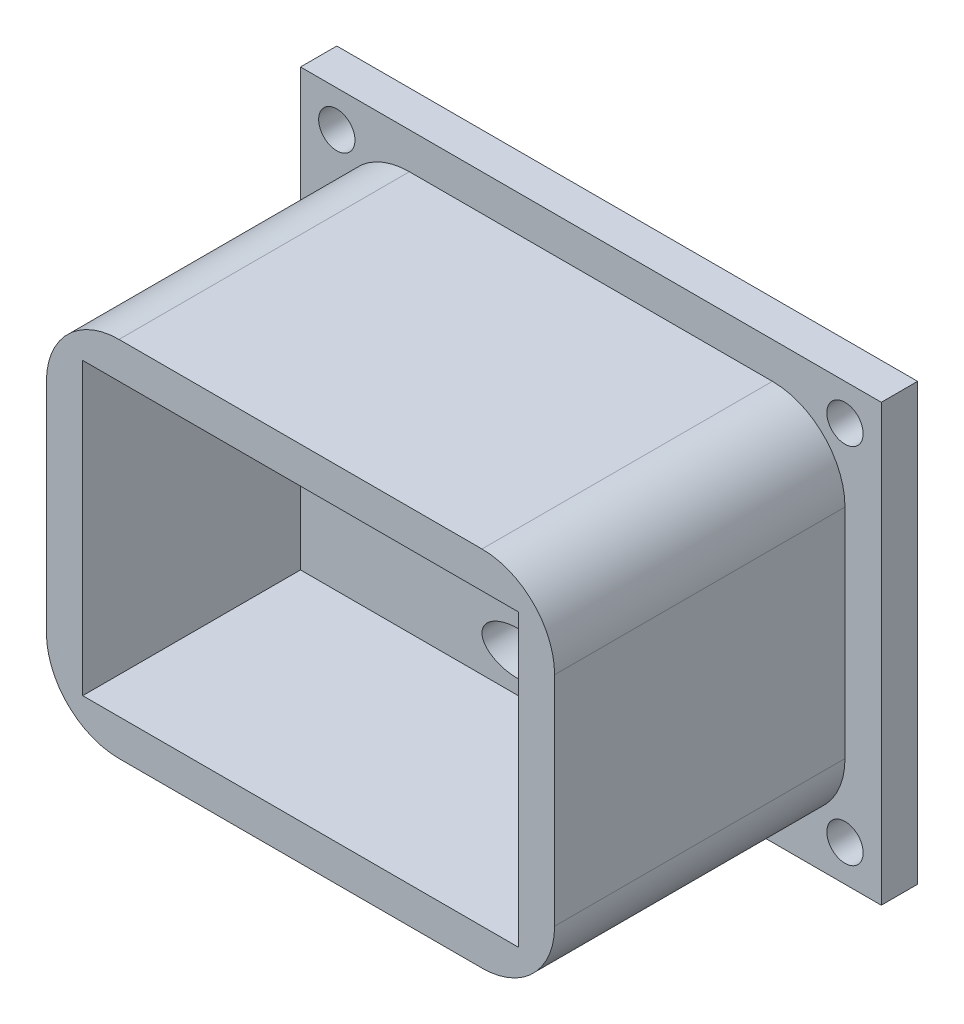
ISO-10303-21;
HEADER;
FILE_DESCRIPTION(('STEP AP214'),'2;1');
FILE_NAME('part.step','',(''),(''),'','','');
FILE_SCHEMA(('AUTOMOTIVE_DESIGN { 1 0 10303 214 1 1 1 1 }'));
ENDSEC;
DATA;
#1=APPLICATION_CONTEXT('core data for automotive mechanical design processes');
#2=APPLICATION_PROTOCOL_DEFINITION('international standard','automotive_design',2000,#1);
#3=PRODUCT_CONTEXT('',#1,'mechanical');
#4=PRODUCT('Part','Part','',(#3));
#5=PRODUCT_RELATED_PRODUCT_CATEGORY('part','',(#4));
#6=PRODUCT_DEFINITION_FORMATION('','',#4);
#7=PRODUCT_DEFINITION_CONTEXT('part definition',#1,'design');
#8=PRODUCT_DEFINITION('design','',#6,#7);
#9=PRODUCT_DEFINITION_SHAPE('','',#8);
#10=(LENGTH_UNIT() NAMED_UNIT(*) SI_UNIT(.MILLI.,.METRE.));
#11=(NAMED_UNIT(*) PLANE_ANGLE_UNIT() SI_UNIT($,.RADIAN.));
#12=(NAMED_UNIT(*) SI_UNIT($,.STERADIAN.) SOLID_ANGLE_UNIT());
#13=UNCERTAINTY_MEASURE_WITH_UNIT(LENGTH_MEASURE(1.E-05),#10,'distance_accuracy_value','');
#14=(GEOMETRIC_REPRESENTATION_CONTEXT(3) GLOBAL_UNCERTAINTY_ASSIGNED_CONTEXT((#13)) GLOBAL_UNIT_ASSIGNED_CONTEXT((#10,
#11,#12)) REPRESENTATION_CONTEXT('',''));
#15=CARTESIAN_POINT('',(0.,0.,0.));
#16=DIRECTION('',(0.,0.,1.));
#17=DIRECTION('',(1.,0.,0.));
#18=AXIS2_PLACEMENT_3D('',#15,#16,#17);
#19=CARTESIAN_POINT('',(0.,0.,40.));
#20=DIRECTION('',(1.,0.,0.));
#21=DIRECTION('',(0.,0.,-1.));
#22=AXIS2_PLACEMENT_3D('',#19,#20,#21);
#23=PLANE('',#22);
#24=DIRECTION('',(0.,-1.,0.));
#25=VECTOR('',#24,1.);
#26=CARTESIAN_POINT('',(0.,0.,0.));
#27=LINE('',#26,#25);
#28=CARTESIAN_POINT('',(0.,40.,0.));
#29=VERTEX_POINT('',#28);
#30=CARTESIAN_POINT('',(0.,10.,0.));
#31=VERTEX_POINT('',#30);
#32=EDGE_CURVE('E201',#29,#31,#27,.T.);
#33=ORIENTED_EDGE('',*,*,#32,.T.);
#34=DIRECTION('',(0.,0.,-1.));
#35=VECTOR('',#34,1.);
#36=CARTESIAN_POINT('',(0.,10.,40.));
#37=LINE('',#36,#35);
#38=CARTESIAN_POINT('',(0.,10.,40.));
#39=VERTEX_POINT('',#38);
#40=EDGE_CURVE('E251',#31,#39,#37,.F.);
#41=ORIENTED_EDGE('',*,*,#40,.T.);
#42=DIRECTION('',(0.,-1.,0.));
#43=VECTOR('',#42,1.);
#44=CARTESIAN_POINT('',(0.,0.,40.));
#45=LINE('',#44,#43);
#46=CARTESIAN_POINT('',(0.,40.,40.));
#47=VERTEX_POINT('',#46);
#48=EDGE_CURVE('E208',#47,#39,#45,.T.);
#49=ORIENTED_EDGE('',*,*,#48,.F.);
#50=DIRECTION('',(0.,0.,-1.));
#51=VECTOR('',#50,1.);
#52=CARTESIAN_POINT('',(0.,40.,40.));
#53=LINE('',#52,#51);
#54=EDGE_CURVE('E248',#47,#29,#53,.T.);
#55=ORIENTED_EDGE('',*,*,#54,.T.);
#56=EDGE_LOOP('',(#33,#41,#49,#55));
#57=FACE_BOUND('',#56,.T.);
#58=ADVANCED_FACE('F33',(#57),#23,.F.);
#59=CARTESIAN_POINT('',(0.,0.,40.));
#60=DIRECTION('',(0.,1.,0.));
#61=DIRECTION('',(0.,0.,1.));
#62=AXIS2_PLACEMENT_3D('',#59,#60,#61);
#63=PLANE('',#62);
#64=DIRECTION('',(1.,0.,0.));
#65=VECTOR('',#64,1.);
#66=CARTESIAN_POINT('',(0.,0.,0.));
#67=LINE('',#66,#65);
#68=CARTESIAN_POINT('',(10.,0.,0.));
#69=VERTEX_POINT('',#68);
#70=CARTESIAN_POINT('',(60.,0.,0.));
#71=VERTEX_POINT('',#70);
#72=EDGE_CURVE('E224',#69,#71,#67,.T.);
#73=ORIENTED_EDGE('',*,*,#72,.T.);
#74=DIRECTION('',(0.,0.,-1.));
#75=VECTOR('',#74,1.);
#76=CARTESIAN_POINT('',(60.,0.,40.));
#77=LINE('',#76,#75);
#78=CARTESIAN_POINT('',(60.,0.,40.));
#79=VERTEX_POINT('',#78);
#80=EDGE_CURVE('E238',#71,#79,#77,.F.);
#81=ORIENTED_EDGE('',*,*,#80,.T.);
#82=DIRECTION('',(1.,0.,0.));
#83=VECTOR('',#82,1.);
#84=CARTESIAN_POINT('',(0.,0.,40.));
#85=LINE('',#84,#83);
#86=CARTESIAN_POINT('',(10.,0.,40.));
#87=VERTEX_POINT('',#86);
#88=EDGE_CURVE('E211',#87,#79,#85,.T.);
#89=ORIENTED_EDGE('',*,*,#88,.F.);
#90=DIRECTION('',(0.,0.,-1.));
#91=VECTOR('',#90,1.);
#92=CARTESIAN_POINT('',(10.,0.,40.));
#93=LINE('',#92,#91);
#94=EDGE_CURVE('E235',#87,#69,#93,.T.);
#95=ORIENTED_EDGE('',*,*,#94,.T.);
#96=EDGE_LOOP('',(#73,#81,#89,#95));
#97=FACE_BOUND('',#96,.T.);
#98=ADVANCED_FACE('F288',(#97),#63,.F.);
#99=CARTESIAN_POINT('',(70.,0.,40.));
#100=DIRECTION('',(-1.,0.,0.));
#101=DIRECTION('',(0.,0.,1.));
#102=AXIS2_PLACEMENT_3D('',#99,#100,#101);
#103=PLANE('',#102);
#104=DIRECTION('',(0.,1.,0.));
#105=VECTOR('',#104,1.);
#106=CARTESIAN_POINT('',(70.,0.,40.));
#107=LINE('',#106,#105);
#108=CARTESIAN_POINT('',(70.,10.,40.));
#109=VERTEX_POINT('',#108);
#110=CARTESIAN_POINT('',(70.,40.,40.));
#111=VERTEX_POINT('',#110);
#112=EDGE_CURVE('E215',#109,#111,#107,.T.);
#113=ORIENTED_EDGE('',*,*,#112,.F.);
#114=DIRECTION('',(0.,0.,-1.));
#115=VECTOR('',#114,1.);
#116=CARTESIAN_POINT('',(70.,10.,40.));
#117=LINE('',#116,#115);
#118=CARTESIAN_POINT('',(70.,10.,0.));
#119=VERTEX_POINT('',#118);
#120=EDGE_CURVE('E232',#109,#119,#117,.T.);
#121=ORIENTED_EDGE('',*,*,#120,.T.);
#122=DIRECTION('',(0.,1.,0.));
#123=VECTOR('',#122,1.);
#124=CARTESIAN_POINT('',(70.,0.,0.));
#125=LINE('',#124,#123);
#126=CARTESIAN_POINT('',(70.,40.,0.));
#127=VERTEX_POINT('',#126);
#128=EDGE_CURVE('E227',#119,#127,#125,.T.);
#129=ORIENTED_EDGE('',*,*,#128,.T.);
#130=DIRECTION('',(0.,0.,-1.));
#131=VECTOR('',#130,1.);
#132=CARTESIAN_POINT('',(70.,40.,40.));
#133=LINE('',#132,#131);
#134=EDGE_CURVE('E221',#127,#111,#133,.F.);
#135=ORIENTED_EDGE('',*,*,#134,.T.);
#136=EDGE_LOOP('',(#113,#121,#129,#135));
#137=FACE_BOUND('',#136,.T.);
#138=ADVANCED_FACE('F265',(#137),#103,.F.);
#139=CARTESIAN_POINT('',(0.,50.,40.));
#140=DIRECTION('',(0.,-1.,0.));
#141=DIRECTION('',(0.,0.,-1.));
#142=AXIS2_PLACEMENT_3D('',#139,#140,#141);
#143=PLANE('',#142);
#144=DIRECTION('',(-1.,0.,0.));
#145=VECTOR('',#144,1.);
#146=CARTESIAN_POINT('',(0.,50.,40.));
#147=LINE('',#146,#145);
#148=CARTESIAN_POINT('',(60.,50.,40.));
#149=VERTEX_POINT('',#148);
#150=CARTESIAN_POINT('',(10.,50.,40.));
#151=VERTEX_POINT('',#150);
#152=EDGE_CURVE('E218',#149,#151,#147,.T.);
#153=ORIENTED_EDGE('',*,*,#152,.F.);
#154=DIRECTION('',(0.,0.,-1.));
#155=VECTOR('',#154,1.);
#156=CARTESIAN_POINT('',(60.,50.,40.));
#157=LINE('',#156,#155);
#158=CARTESIAN_POINT('',(60.,50.,0.));
#159=VERTEX_POINT('',#158);
#160=EDGE_CURVE('E255',#149,#159,#157,.T.);
#161=ORIENTED_EDGE('',*,*,#160,.T.);
#162=DIRECTION('',(-1.,0.,0.));
#163=VECTOR('',#162,1.);
#164=CARTESIAN_POINT('',(0.,50.,0.));
#165=LINE('',#164,#163);
#166=CARTESIAN_POINT('',(10.,50.,0.));
#167=VERTEX_POINT('',#166);
#168=EDGE_CURVE('E212',#159,#167,#165,.T.);
#169=ORIENTED_EDGE('',*,*,#168,.T.);
#170=DIRECTION('',(0.,0.,-1.));
#171=VECTOR('',#170,1.);
#172=CARTESIAN_POINT('',(10.,50.,40.));
#173=LINE('',#172,#171);
#174=EDGE_CURVE('E253',#167,#151,#173,.F.);
#175=ORIENTED_EDGE('',*,*,#174,.T.);
#176=EDGE_LOOP('',(#153,#161,#169,#175));
#177=FACE_BOUND('',#176,.T.);
#178=ADVANCED_FACE('F274',(#177),#143,.F.);
#179=CARTESIAN_POINT('',(0.,0.,40.));
#180=DIRECTION('',(0.,0.,-1.));
#181=DIRECTION('',(-1.,0.,0.));
#182=AXIS2_PLACEMENT_3D('',#179,#180,#181);
#183=PLANE('',#182);
#184=DIRECTION('',(1.,0.,0.));
#185=VECTOR('',#184,1.);
#186=CARTESIAN_POINT('',(65.,5.00000000000001,40.));
#187=LINE('',#186,#185);
#188=CARTESIAN_POINT('',(5.,5.00000000000001,40.));
#189=VERTEX_POINT('',#188);
#190=CARTESIAN_POINT('',(65.,5.00000000000001,40.));
#191=VERTEX_POINT('',#190);
#192=EDGE_CURVE('E172',#189,#191,#187,.T.);
#193=ORIENTED_EDGE('',*,*,#192,.F.);
#194=DIRECTION('',(0.,-1.,0.));
#195=VECTOR('',#194,1.);
#196=CARTESIAN_POINT('',(5.,5.00000000000001,40.));
#197=LINE('',#196,#195);
#198=CARTESIAN_POINT('',(5.,45.,40.));
#199=VERTEX_POINT('',#198);
#200=EDGE_CURVE('E170',#199,#189,#197,.T.);
#201=ORIENTED_EDGE('',*,*,#200,.F.);
#202=DIRECTION('',(-1.,0.,0.));
#203=VECTOR('',#202,1.);
#204=CARTESIAN_POINT('',(5.,45.,40.));
#205=LINE('',#204,#203);
#206=CARTESIAN_POINT('',(65.,45.,40.));
#207=VERTEX_POINT('',#206);
#208=EDGE_CURVE('E182',#207,#199,#205,.T.);
#209=ORIENTED_EDGE('',*,*,#208,.F.);
#210=DIRECTION('',(0.,1.,0.));
#211=VECTOR('',#210,1.);
#212=CARTESIAN_POINT('',(65.,45.,40.));
#213=LINE('',#212,#211);
#214=EDGE_CURVE('E194',#191,#207,#213,.T.);
#215=ORIENTED_EDGE('',*,*,#214,.F.);
#216=EDGE_LOOP('',(#193,#201,#209,#215));
#217=FACE_BOUND('',#216,.T.);
#218=ORIENTED_EDGE('',*,*,#88,.T.);
#219=CARTESIAN_POINT('',(60.,10.,40.));
#220=DIRECTION('',(0.,0.,-1.));
#221=DIRECTION('',(-1.,0.,0.));
#222=AXIS2_PLACEMENT_3D('',#219,#220,#221);
#223=CIRCLE('',#222,10.);
#224=EDGE_CURVE('E246',#79,#109,#223,.F.);
#225=ORIENTED_EDGE('',*,*,#224,.T.);
#226=ORIENTED_EDGE('',*,*,#112,.T.);
#227=CARTESIAN_POINT('',(60.,40.,40.));
#228=DIRECTION('',(0.,0.,-1.));
#229=DIRECTION('',(-1.,0.,0.));
#230=AXIS2_PLACEMENT_3D('',#227,#228,#229);
#231=CIRCLE('',#230,10.);
#232=EDGE_CURVE('E242',#111,#149,#231,.F.);
#233=ORIENTED_EDGE('',*,*,#232,.T.);
#234=ORIENTED_EDGE('',*,*,#152,.T.);
#235=CARTESIAN_POINT('',(10.,40.,40.));
#236=DIRECTION('',(0.,0.,-1.));
#237=DIRECTION('',(-1.,0.,0.));
#238=AXIS2_PLACEMENT_3D('',#235,#236,#237);
#239=CIRCLE('',#238,10.);
#240=EDGE_CURVE('E240',#151,#47,#239,.F.);
#241=ORIENTED_EDGE('',*,*,#240,.T.);
#242=ORIENTED_EDGE('',*,*,#48,.T.);
#243=CARTESIAN_POINT('',(10.,10.,40.));
#244=DIRECTION('',(0.,0.,-1.));
#245=DIRECTION('',(-1.,0.,0.));
#246=AXIS2_PLACEMENT_3D('',#243,#244,#245);
#247=CIRCLE('',#246,10.);
#248=EDGE_CURVE('E244',#39,#87,#247,.F.);
#249=ORIENTED_EDGE('',*,*,#248,.T.);
#250=EDGE_LOOP('',(#218,#225,#226,#233,#234,#241,#242,#249));
#251=FACE_BOUND('',#250,.T.);
#252=ADVANCED_FACE('F271',(#217,#251),#183,.F.);
#253=CARTESIAN_POINT('',(5.,5.00000000000001,10.));
#254=DIRECTION('',(-1.,0.,0.));
#255=DIRECTION('',(0.,0.,1.));
#256=AXIS2_PLACEMENT_3D('',#253,#254,#255);
#257=PLANE('',#256);
#258=ORIENTED_EDGE('',*,*,#200,.T.);
#259=DIRECTION('',(0.,0.,1.));
#260=VECTOR('',#259,1.);
#261=CARTESIAN_POINT('',(5.,5.00000000000001,10.));
#262=LINE('',#261,#260);
#263=CARTESIAN_POINT('',(5.,5.00000000000001,10.));
#264=VERTEX_POINT('',#263);
#265=EDGE_CURVE('E190',#264,#189,#262,.T.);
#266=ORIENTED_EDGE('',*,*,#265,.F.);
#267=DIRECTION('',(0.,-1.,0.));
#268=VECTOR('',#267,1.);
#269=CARTESIAN_POINT('',(5.,5.00000000000001,10.));
#270=LINE('',#269,#268);
#271=CARTESIAN_POINT('',(5.,45.,10.));
#272=VERTEX_POINT('',#271);
#273=EDGE_CURVE('E178',#272,#264,#270,.T.);
#274=ORIENTED_EDGE('',*,*,#273,.F.);
#275=DIRECTION('',(0.,0.,1.));
#276=VECTOR('',#275,1.);
#277=CARTESIAN_POINT('',(5.,45.,10.));
#278=LINE('',#277,#276);
#279=EDGE_CURVE('E199',#272,#199,#278,.T.);
#280=ORIENTED_EDGE('',*,*,#279,.T.);
#281=EDGE_LOOP('',(#258,#266,#274,#280));
#282=FACE_BOUND('',#281,.T.);
#283=ADVANCED_FACE('F316',(#282),#257,.F.);
#284=CARTESIAN_POINT('',(5.,45.,10.));
#285=DIRECTION('',(0.,1.,0.));
#286=DIRECTION('',(0.,0.,1.));
#287=AXIS2_PLACEMENT_3D('',#284,#285,#286);
#288=PLANE('',#287);
#289=ORIENTED_EDGE('',*,*,#208,.T.);
#290=ORIENTED_EDGE('',*,*,#279,.F.);
#291=DIRECTION('',(-1.,0.,0.));
#292=VECTOR('',#291,1.);
#293=CARTESIAN_POINT('',(5.,45.,10.));
#294=LINE('',#293,#292);
#295=CARTESIAN_POINT('',(65.,45.,10.));
#296=VERTEX_POINT('',#295);
#297=EDGE_CURVE('E188',#296,#272,#294,.T.);
#298=ORIENTED_EDGE('',*,*,#297,.F.);
#299=DIRECTION('',(0.,0.,1.));
#300=VECTOR('',#299,1.);
#301=CARTESIAN_POINT('',(65.,45.,10.));
#302=LINE('',#301,#300);
#303=EDGE_CURVE('E202',#296,#207,#302,.T.);
#304=ORIENTED_EDGE('',*,*,#303,.T.);
#305=EDGE_LOOP('',(#289,#290,#298,#304));
#306=FACE_BOUND('',#305,.T.);
#307=ADVANCED_FACE('F320',(#306),#288,.F.);
#308=CARTESIAN_POINT('',(65.,45.,10.));
#309=DIRECTION('',(1.,0.,0.));
#310=DIRECTION('',(0.,0.,-1.));
#311=AXIS2_PLACEMENT_3D('',#308,#309,#310);
#312=PLANE('',#311);
#313=ORIENTED_EDGE('',*,*,#214,.T.);
#314=ORIENTED_EDGE('',*,*,#303,.F.);
#315=DIRECTION('',(0.,1.,0.));
#316=VECTOR('',#315,1.);
#317=CARTESIAN_POINT('',(65.,45.,10.));
#318=LINE('',#317,#316);
#319=CARTESIAN_POINT('',(65.,5.00000000000001,10.));
#320=VERTEX_POINT('',#319);
#321=EDGE_CURVE('E185',#320,#296,#318,.T.);
#322=ORIENTED_EDGE('',*,*,#321,.F.);
#323=DIRECTION('',(0.,0.,1.));
#324=VECTOR('',#323,1.);
#325=CARTESIAN_POINT('',(65.,5.00000000000001,10.));
#326=LINE('',#325,#324);
#327=EDGE_CURVE('E204',#320,#191,#326,.T.);
#328=ORIENTED_EDGE('',*,*,#327,.T.);
#329=EDGE_LOOP('',(#313,#314,#322,#328));
#330=FACE_BOUND('',#329,.T.);
#331=ADVANCED_FACE('F326',(#330),#312,.F.);
#332=CARTESIAN_POINT('',(65.,5.00000000000001,10.));
#333=DIRECTION('',(0.,-1.,0.));
#334=DIRECTION('',(0.,0.,-1.));
#335=AXIS2_PLACEMENT_3D('',#332,#333,#334);
#336=PLANE('',#335);
#337=ORIENTED_EDGE('',*,*,#192,.T.);
#338=ORIENTED_EDGE('',*,*,#327,.F.);
#339=DIRECTION('',(1.,0.,0.));
#340=VECTOR('',#339,1.);
#341=CARTESIAN_POINT('',(65.,5.00000000000001,10.));
#342=LINE('',#341,#340);
#343=EDGE_CURVE('E181',#264,#320,#342,.T.);
#344=ORIENTED_EDGE('',*,*,#343,.F.);
#345=ORIENTED_EDGE('',*,*,#265,.T.);
#346=EDGE_LOOP('',(#337,#338,#344,#345));
#347=FACE_BOUND('',#346,.T.);
#348=ADVANCED_FACE('F322',(#347),#336,.F.);
#349=CARTESIAN_POINT('',(0.,0.,10.));
#350=DIRECTION('',(0.,0.,-1.));
#351=DIRECTION('',(-1.,0.,0.));
#352=AXIS2_PLACEMENT_3D('',#349,#350,#351);
#353=PLANE('',#352);
#354=CARTESIAN_POINT('',(35.,10.,10.));
#355=DIRECTION('',(0.,0.,1.));
#356=DIRECTION('',(-1.,0.,0.));
#357=AXIS2_PLACEMENT_3D('',#354,#355,#356);
#358=ELLIPSE('',#357,5.,3.);
#359=CARTESIAN_POINT('',(30.,10.,10.));
#360=VERTEX_POINT('',#359);
#361=EDGE_CURVE('E374',#360,#360,#358,.T.);
#362=ORIENTED_EDGE('',*,*,#361,.F.);
#363=EDGE_LOOP('',(#362));
#364=FACE_BOUND('',#363,.T.);
#365=ORIENTED_EDGE('',*,*,#273,.T.);
#366=ORIENTED_EDGE('',*,*,#343,.T.);
#367=ORIENTED_EDGE('',*,*,#321,.T.);
#368=ORIENTED_EDGE('',*,*,#297,.T.);
#369=EDGE_LOOP('',(#365,#366,#367,#368));
#370=FACE_BOUND('',#369,.T.);
#371=ADVANCED_FACE('F325',(#364,#370),#353,.F.);
#372=CARTESIAN_POINT('',(0.,0.,0.));
#373=DIRECTION('',(0.,0.,1.));
#374=DIRECTION('',(1.,0.,0.));
#375=AXIS2_PLACEMENT_3D('',#372,#373,#374);
#376=PLANE('',#375);
#377=CARTESIAN_POINT('',(0.,0.,0.));
#378=DIRECTION('',(0.,0.,1.));
#379=DIRECTION('',(1.,0.,0.));
#380=AXIS2_PLACEMENT_3D('',#377,#378,#379);
#381=CIRCLE('',#380,2.5);
#382=CARTESIAN_POINT('',(2.5,0.,0.));
#383=VERTEX_POINT('',#382);
#384=EDGE_CURVE('E393',#383,#383,#381,.T.);
#385=ORIENTED_EDGE('',*,*,#384,.F.);
#386=EDGE_LOOP('',(#385));
#387=FACE_BOUND('',#386,.T.);
#388=CARTESIAN_POINT('',(70.,0.,0.));
#389=DIRECTION('',(0.,0.,1.));
#390=DIRECTION('',(1.,0.,0.));
#391=AXIS2_PLACEMENT_3D('',#388,#389,#390);
#392=CIRCLE('',#391,2.5);
#393=CARTESIAN_POINT('',(72.5,0.,0.));
#394=VERTEX_POINT('',#393);
#395=EDGE_CURVE('E387',#394,#394,#392,.T.);
#396=ORIENTED_EDGE('',*,*,#395,.F.);
#397=EDGE_LOOP('',(#396));
#398=FACE_BOUND('',#397,.T.);
#399=CARTESIAN_POINT('',(70.,50.,0.));
#400=DIRECTION('',(0.,0.,1.));
#401=DIRECTION('',(1.,0.,0.));
#402=AXIS2_PLACEMENT_3D('',#399,#400,#401);
#403=CIRCLE('',#402,2.50000000000001);
#404=CARTESIAN_POINT('',(72.5,50.,0.));
#405=VERTEX_POINT('',#404);
#406=EDGE_CURVE('E381',#405,#405,#403,.T.);
#407=ORIENTED_EDGE('',*,*,#406,.F.);
#408=EDGE_LOOP('',(#407));
#409=FACE_BOUND('',#408,.T.);
#410=CARTESIAN_POINT('',(0.,50.,0.));
#411=DIRECTION('',(0.,0.,1.));
#412=DIRECTION('',(1.,0.,0.));
#413=AXIS2_PLACEMENT_3D('',#410,#411,#412);
#414=CIRCLE('',#413,2.5);
#415=CARTESIAN_POINT('',(2.5,50.,0.));
#416=VERTEX_POINT('',#415);
#417=EDGE_CURVE('E380',#416,#416,#414,.T.);
#418=ORIENTED_EDGE('',*,*,#417,.F.);
#419=EDGE_LOOP('',(#418));
#420=FACE_BOUND('',#419,.T.);
#421=DIRECTION('',(-1.,0.,0.));
#422=VECTOR('',#421,1.);
#423=CARTESIAN_POINT('',(-4.99999999999999,-5.,0.));
#424=LINE('',#423,#422);
#425=CARTESIAN_POINT('',(75.,-5.,0.));
#426=VERTEX_POINT('',#425);
#427=CARTESIAN_POINT('',(-4.99999999999999,-5.,0.));
#428=VERTEX_POINT('',#427);
#429=EDGE_CURVE('E399',#426,#428,#424,.T.);
#430=ORIENTED_EDGE('',*,*,#429,.F.);
#431=DIRECTION('',(0.,-1.,0.));
#432=VECTOR('',#431,1.);
#433=CARTESIAN_POINT('',(75.,50.,0.));
#434=LINE('',#433,#432);
#435=CARTESIAN_POINT('',(75.,55.,0.));
#436=VERTEX_POINT('',#435);
#437=EDGE_CURVE('E165',#436,#426,#434,.T.);
#438=ORIENTED_EDGE('',*,*,#437,.F.);
#439=DIRECTION('',(1.,0.,0.));
#440=VECTOR('',#439,1.);
#441=CARTESIAN_POINT('',(75.,55.,0.));
#442=LINE('',#441,#440);
#443=CARTESIAN_POINT('',(-4.99999999999999,55.,0.));
#444=VERTEX_POINT('',#443);
#445=EDGE_CURVE('E408',#444,#436,#442,.T.);
#446=ORIENTED_EDGE('',*,*,#445,.F.);
#447=DIRECTION('',(0.,1.,0.));
#448=VECTOR('',#447,1.);
#449=CARTESIAN_POINT('',(-4.99999999999999,55.,0.));
#450=LINE('',#449,#448);
#451=EDGE_CURVE('E406',#428,#444,#450,.T.);
#452=ORIENTED_EDGE('',*,*,#451,.F.);
#453=EDGE_LOOP('',(#430,#438,#446,#452));
#454=FACE_BOUND('',#453,.T.);
#455=ORIENTED_EDGE('',*,*,#32,.F.);
#456=CARTESIAN_POINT('',(10.,40.,0.));
#457=DIRECTION('',(0.,0.,1.));
#458=DIRECTION('',(1.,0.,0.));
#459=AXIS2_PLACEMENT_3D('',#456,#457,#458);
#460=CIRCLE('',#459,10.);
#461=EDGE_CURVE('E11',#29,#167,#460,.F.);
#462=ORIENTED_EDGE('',*,*,#461,.T.);
#463=ORIENTED_EDGE('',*,*,#168,.F.);
#464=CARTESIAN_POINT('',(60.,40.,0.));
#465=DIRECTION('',(0.,0.,1.));
#466=DIRECTION('',(1.,0.,0.));
#467=AXIS2_PLACEMENT_3D('',#464,#465,#466);
#468=CIRCLE('',#467,10.);
#469=EDGE_CURVE('E42',#159,#127,#468,.F.);
#470=ORIENTED_EDGE('',*,*,#469,.T.);
#471=ORIENTED_EDGE('',*,*,#128,.F.);
#472=CARTESIAN_POINT('',(60.,10.,0.));
#473=DIRECTION('',(0.,0.,1.));
#474=DIRECTION('',(1.,0.,0.));
#475=AXIS2_PLACEMENT_3D('',#472,#473,#474);
#476=CIRCLE('',#475,10.);
#477=EDGE_CURVE('E257',#119,#71,#476,.F.);
#478=ORIENTED_EDGE('',*,*,#477,.T.);
#479=ORIENTED_EDGE('',*,*,#72,.F.);
#480=CARTESIAN_POINT('',(10.,10.,0.));
#481=DIRECTION('',(0.,0.,1.));
#482=DIRECTION('',(1.,0.,0.));
#483=AXIS2_PLACEMENT_3D('',#480,#481,#482);
#484=CIRCLE('',#483,10.);
#485=EDGE_CURVE('E259',#69,#31,#484,.F.);
#486=ORIENTED_EDGE('',*,*,#485,.T.);
#487=EDGE_LOOP('',(#455,#462,#463,#470,#471,#478,#479,#486));
#488=FACE_BOUND('',#487,.T.);
#489=ADVANCED_FACE('F262',(#387,#398,#409,#420,#454,#488),#376,.T.);
#490=CARTESIAN_POINT('',(-4.99999999999999,-5.,-5.));
#491=DIRECTION('',(0.,1.,0.));
#492=DIRECTION('',(0.,0.,1.));
#493=AXIS2_PLACEMENT_3D('',#490,#491,#492);
#494=PLANE('',#493);
#495=ORIENTED_EDGE('',*,*,#429,.T.);
#496=DIRECTION('',(0.,0.,1.));
#497=VECTOR('',#496,1.);
#498=CARTESIAN_POINT('',(-4.99999999999999,-5.,-5.));
#499=LINE('',#498,#497);
#500=CARTESIAN_POINT('',(-4.99999999999999,-5.,-5.));
#501=VERTEX_POINT('',#500);
#502=EDGE_CURVE('E152',#501,#428,#499,.T.);
#503=ORIENTED_EDGE('',*,*,#502,.F.);
#504=DIRECTION('',(-1.,0.,0.));
#505=VECTOR('',#504,1.);
#506=CARTESIAN_POINT('',(-4.99999999999999,-5.,-5.));
#507=LINE('',#506,#505);
#508=CARTESIAN_POINT('',(75.,-5.,-5.));
#509=VERTEX_POINT('',#508);
#510=EDGE_CURVE('E146',#509,#501,#507,.T.);
#511=ORIENTED_EDGE('',*,*,#510,.F.);
#512=DIRECTION('',(0.,0.,1.));
#513=VECTOR('',#512,1.);
#514=CARTESIAN_POINT('',(75.,-5.,-5.));
#515=LINE('',#514,#513);
#516=EDGE_CURVE('E150',#509,#426,#515,.T.);
#517=ORIENTED_EDGE('',*,*,#516,.T.);
#518=EDGE_LOOP('',(#495,#503,#511,#517));
#519=FACE_BOUND('',#518,.T.);
#520=ADVANCED_FACE('F148',(#519),#494,.F.);
#521=CARTESIAN_POINT('',(-4.99999999999999,55.,-5.));
#522=DIRECTION('',(1.,0.,0.));
#523=DIRECTION('',(0.,0.,-1.));
#524=AXIS2_PLACEMENT_3D('',#521,#522,#523);
#525=PLANE('',#524);
#526=ORIENTED_EDGE('',*,*,#451,.T.);
#527=DIRECTION('',(0.,0.,1.));
#528=VECTOR('',#527,1.);
#529=CARTESIAN_POINT('',(-4.99999999999999,55.,-5.));
#530=LINE('',#529,#528);
#531=CARTESIAN_POINT('',(-4.99999999999999,55.,-5.));
#532=VERTEX_POINT('',#531);
#533=EDGE_CURVE('E174',#532,#444,#530,.T.);
#534=ORIENTED_EDGE('',*,*,#533,.F.);
#535=DIRECTION('',(0.,1.,0.));
#536=VECTOR('',#535,1.);
#537=CARTESIAN_POINT('',(-4.99999999999999,55.,-5.));
#538=LINE('',#537,#536);
#539=EDGE_CURVE('E155',#501,#532,#538,.T.);
#540=ORIENTED_EDGE('',*,*,#539,.F.);
#541=ORIENTED_EDGE('',*,*,#502,.T.);
#542=EDGE_LOOP('',(#526,#534,#540,#541));
#543=FACE_BOUND('',#542,.T.);
#544=ADVANCED_FACE('F339',(#543),#525,.F.);
#545=CARTESIAN_POINT('',(75.,55.,-5.));
#546=DIRECTION('',(0.,-1.,0.));
#547=DIRECTION('',(0.,0.,-1.));
#548=AXIS2_PLACEMENT_3D('',#545,#546,#547);
#549=PLANE('',#548);
#550=ORIENTED_EDGE('',*,*,#445,.T.);
#551=DIRECTION('',(0.,0.,1.));
#552=VECTOR('',#551,1.);
#553=CARTESIAN_POINT('',(75.,55.,-5.));
#554=LINE('',#553,#552);
#555=CARTESIAN_POINT('',(75.,55.,-5.));
#556=VERTEX_POINT('',#555);
#557=EDGE_CURVE('E404',#556,#436,#554,.T.);
#558=ORIENTED_EDGE('',*,*,#557,.F.);
#559=DIRECTION('',(1.,0.,0.));
#560=VECTOR('',#559,1.);
#561=CARTESIAN_POINT('',(75.,55.,-5.));
#562=LINE('',#561,#560);
#563=EDGE_CURVE('E161',#532,#556,#562,.T.);
#564=ORIENTED_EDGE('',*,*,#563,.F.);
#565=ORIENTED_EDGE('',*,*,#533,.T.);
#566=EDGE_LOOP('',(#550,#558,#564,#565));
#567=FACE_BOUND('',#566,.T.);
#568=ADVANCED_FACE('F342',(#567),#549,.F.);
#569=CARTESIAN_POINT('',(75.,50.,-5.));
#570=DIRECTION('',(-1.,0.,0.));
#571=DIRECTION('',(0.,0.,1.));
#572=AXIS2_PLACEMENT_3D('',#569,#570,#571);
#573=PLANE('',#572);
#574=ORIENTED_EDGE('',*,*,#437,.T.);
#575=ORIENTED_EDGE('',*,*,#516,.F.);
#576=DIRECTION('',(0.,-1.,0.));
#577=VECTOR('',#576,1.);
#578=CARTESIAN_POINT('',(75.,-5.,-5.));
#579=LINE('',#578,#577);
#580=EDGE_CURVE('E156',#556,#509,#579,.T.);
#581=ORIENTED_EDGE('',*,*,#580,.F.);
#582=ORIENTED_EDGE('',*,*,#557,.T.);
#583=EDGE_LOOP('',(#574,#575,#581,#582));
#584=FACE_BOUND('',#583,.T.);
#585=ADVANCED_FACE('F167',(#584),#573,.F.);
#586=CARTESIAN_POINT('',(0.,0.,-5.));
#587=DIRECTION('',(0.,0.,1.));
#588=DIRECTION('',(1.,0.,0.));
#589=AXIS2_PLACEMENT_3D('',#586,#587,#588);
#590=PLANE('',#589);
#591=CARTESIAN_POINT('',(35.,10.,-5.));
#592=DIRECTION('',(0.,0.,1.));
#593=DIRECTION('',(-1.,0.,0.));
#594=AXIS2_PLACEMENT_3D('',#591,#592,#593);
#595=ELLIPSE('',#594,5.,3.);
#596=CARTESIAN_POINT('',(30.,10.,-5.));
#597=VERTEX_POINT('',#596);
#598=EDGE_CURVE('E37',#597,#597,#595,.T.);
#599=ORIENTED_EDGE('',*,*,#598,.T.);
#600=EDGE_LOOP('',(#599));
#601=FACE_BOUND('',#600,.T.);
#602=CARTESIAN_POINT('',(0.,0.,-5.));
#603=DIRECTION('',(0.,0.,1.));
#604=DIRECTION('',(1.,0.,0.));
#605=AXIS2_PLACEMENT_3D('',#602,#603,#604);
#606=CIRCLE('',#605,2.5);
#607=CARTESIAN_POINT('',(2.5,0.,-5.));
#608=VERTEX_POINT('',#607);
#609=EDGE_CURVE('E390',#608,#608,#606,.T.);
#610=ORIENTED_EDGE('',*,*,#609,.T.);
#611=EDGE_LOOP('',(#610));
#612=FACE_BOUND('',#611,.T.);
#613=CARTESIAN_POINT('',(70.,0.,-5.));
#614=DIRECTION('',(0.,0.,1.));
#615=DIRECTION('',(1.,0.,0.));
#616=AXIS2_PLACEMENT_3D('',#613,#614,#615);
#617=CIRCLE('',#616,2.5);
#618=CARTESIAN_POINT('',(72.5,0.,-5.));
#619=VERTEX_POINT('',#618);
#620=EDGE_CURVE('E384',#619,#619,#617,.T.);
#621=ORIENTED_EDGE('',*,*,#620,.T.);
#622=EDGE_LOOP('',(#621));
#623=FACE_BOUND('',#622,.T.);
#624=CARTESIAN_POINT('',(70.,50.,-5.));
#625=DIRECTION('',(0.,0.,1.));
#626=DIRECTION('',(1.,0.,0.));
#627=AXIS2_PLACEMENT_3D('',#624,#625,#626);
#628=CIRCLE('',#627,2.50000000000001);
#629=CARTESIAN_POINT('',(72.5,50.,-5.));
#630=VERTEX_POINT('',#629);
#631=EDGE_CURVE('E377',#630,#630,#628,.T.);
#632=ORIENTED_EDGE('',*,*,#631,.T.);
#633=EDGE_LOOP('',(#632));
#634=FACE_BOUND('',#633,.T.);
#635=CARTESIAN_POINT('',(0.,50.,-5.));
#636=DIRECTION('',(0.,0.,1.));
#637=DIRECTION('',(1.,0.,0.));
#638=AXIS2_PLACEMENT_3D('',#635,#636,#637);
#639=CIRCLE('',#638,2.5);
#640=CARTESIAN_POINT('',(2.5,50.,-5.));
#641=VERTEX_POINT('',#640);
#642=EDGE_CURVE('E396',#641,#641,#639,.T.);
#643=ORIENTED_EDGE('',*,*,#642,.T.);
#644=EDGE_LOOP('',(#643));
#645=FACE_BOUND('',#644,.T.);
#646=ORIENTED_EDGE('',*,*,#580,.T.);
#647=ORIENTED_EDGE('',*,*,#510,.T.);
#648=ORIENTED_EDGE('',*,*,#539,.T.);
#649=ORIENTED_EDGE('',*,*,#563,.T.);
#650=EDGE_LOOP('',(#646,#647,#648,#649));
#651=FACE_BOUND('',#650,.T.);
#652=ADVANCED_FACE('F159',(#601,#612,#623,#634,#645,#651),#590,.F.);
#653=CARTESIAN_POINT('',(60.,10.,40.));
#654=DIRECTION('',(0.,0.,-1.));
#655=DIRECTION('',(-1.,0.,0.));
#656=AXIS2_PLACEMENT_3D('',#653,#654,#655);
#657=CYLINDRICAL_SURFACE('',#656,10.);
#658=ORIENTED_EDGE('',*,*,#224,.F.);
#659=ORIENTED_EDGE('',*,*,#80,.F.);
#660=ORIENTED_EDGE('',*,*,#477,.F.);
#661=ORIENTED_EDGE('',*,*,#120,.F.);
#662=EDGE_LOOP('',(#658,#659,#660,#661));
#663=FACE_BOUND('',#662,.T.);
#664=ADVANCED_FACE('F292',(#663),#657,.T.);
#665=CARTESIAN_POINT('',(10.,10.,40.));
#666=DIRECTION('',(0.,0.,-1.));
#667=DIRECTION('',(-1.,0.,0.));
#668=AXIS2_PLACEMENT_3D('',#665,#666,#667);
#669=CYLINDRICAL_SURFACE('',#668,10.);
#670=ORIENTED_EDGE('',*,*,#248,.F.);
#671=ORIENTED_EDGE('',*,*,#40,.F.);
#672=ORIENTED_EDGE('',*,*,#485,.F.);
#673=ORIENTED_EDGE('',*,*,#94,.F.);
#674=EDGE_LOOP('',(#670,#671,#672,#673));
#675=FACE_BOUND('',#674,.T.);
#676=ADVANCED_FACE('F283',(#675),#669,.T.);
#677=CARTESIAN_POINT('',(60.,40.,40.));
#678=DIRECTION('',(0.,0.,-1.));
#679=DIRECTION('',(-1.,0.,0.));
#680=AXIS2_PLACEMENT_3D('',#677,#678,#679);
#681=CYLINDRICAL_SURFACE('',#680,10.);
#682=ORIENTED_EDGE('',*,*,#232,.F.);
#683=ORIENTED_EDGE('',*,*,#134,.F.);
#684=ORIENTED_EDGE('',*,*,#469,.F.);
#685=ORIENTED_EDGE('',*,*,#160,.F.);
#686=EDGE_LOOP('',(#682,#683,#684,#685));
#687=FACE_BOUND('',#686,.T.);
#688=ADVANCED_FACE('F268',(#687),#681,.T.);
#689=CARTESIAN_POINT('',(10.,40.,40.));
#690=DIRECTION('',(0.,0.,-1.));
#691=DIRECTION('',(-1.,0.,0.));
#692=AXIS2_PLACEMENT_3D('',#689,#690,#691);
#693=CYLINDRICAL_SURFACE('',#692,10.);
#694=ORIENTED_EDGE('',*,*,#240,.F.);
#695=ORIENTED_EDGE('',*,*,#174,.F.);
#696=ORIENTED_EDGE('',*,*,#461,.F.);
#697=ORIENTED_EDGE('',*,*,#54,.F.);
#698=EDGE_LOOP('',(#694,#695,#696,#697));
#699=FACE_BOUND('',#698,.T.);
#700=ADVANCED_FACE('F35',(#699),#693,.T.);
#701=CARTESIAN_POINT('',(0.,50.,-5.));
#702=DIRECTION('',(0.,0.,1.));
#703=DIRECTION('',(1.,0.,0.));
#704=AXIS2_PLACEMENT_3D('',#701,#702,#703);
#705=CYLINDRICAL_SURFACE('',#704,2.5);
#706=ORIENTED_EDGE('',*,*,#642,.F.);
#707=EDGE_LOOP('',(#706));
#708=FACE_BOUND('',#707,.T.);
#709=ORIENTED_EDGE('',*,*,#417,.T.);
#710=EDGE_LOOP('',(#709));
#711=FACE_BOUND('',#710,.T.);
#712=ADVANCED_FACE('F352',(#708,#711),#705,.F.);
#713=CARTESIAN_POINT('',(70.,50.,-5.));
#714=DIRECTION('',(0.,0.,1.));
#715=DIRECTION('',(1.,0.,0.));
#716=AXIS2_PLACEMENT_3D('',#713,#714,#715);
#717=CYLINDRICAL_SURFACE('',#716,2.50000000000001);
#718=ORIENTED_EDGE('',*,*,#631,.F.);
#719=EDGE_LOOP('',(#718));
#720=FACE_BOUND('',#719,.T.);
#721=ORIENTED_EDGE('',*,*,#406,.T.);
#722=EDGE_LOOP('',(#721));
#723=FACE_BOUND('',#722,.T.);
#724=ADVANCED_FACE('F355',(#720,#723),#717,.F.);
#725=CARTESIAN_POINT('',(70.,0.,-5.));
#726=DIRECTION('',(0.,0.,1.));
#727=DIRECTION('',(1.,0.,0.));
#728=AXIS2_PLACEMENT_3D('',#725,#726,#727);
#729=CYLINDRICAL_SURFACE('',#728,2.5);
#730=ORIENTED_EDGE('',*,*,#620,.F.);
#731=EDGE_LOOP('',(#730));
#732=FACE_BOUND('',#731,.T.);
#733=ORIENTED_EDGE('',*,*,#395,.T.);
#734=EDGE_LOOP('',(#733));
#735=FACE_BOUND('',#734,.T.);
#736=ADVANCED_FACE('F361',(#732,#735),#729,.F.);
#737=CARTESIAN_POINT('',(0.,0.,-5.));
#738=DIRECTION('',(0.,0.,1.));
#739=DIRECTION('',(1.,0.,0.));
#740=AXIS2_PLACEMENT_3D('',#737,#738,#739);
#741=CYLINDRICAL_SURFACE('',#740,2.5);
#742=ORIENTED_EDGE('',*,*,#609,.F.);
#743=EDGE_LOOP('',(#742));
#744=FACE_BOUND('',#743,.T.);
#745=ORIENTED_EDGE('',*,*,#384,.T.);
#746=EDGE_LOOP('',(#745));
#747=FACE_BOUND('',#746,.T.);
#748=ADVANCED_FACE('F357',(#744,#747),#741,.F.);
#749=CARTESIAN_POINT('',(35.,10.,-10.));
#750=DIRECTION('',(0.,0.,1.));
#751=DIRECTION('',(-1.,0.,0.));
#752=AXIS2_PLACEMENT_3D('',#749,#750,#751);
#753=ELLIPSE('',#752,5.,3.);
#754=DIRECTION('',(0.,0.,1.));
#755=VECTOR('',#754,1.);
#756=SURFACE_OF_LINEAR_EXTRUSION('',#753,#755);
#757=ORIENTED_EDGE('',*,*,#361,.T.);
#758=EDGE_LOOP('',(#757));
#759=FACE_BOUND('',#758,.T.);
#760=ORIENTED_EDGE('',*,*,#598,.F.);
#761=EDGE_LOOP('',(#760));
#762=FACE_BOUND('',#761,.T.);
#763=ADVANCED_FACE('F360',(#759,#762),#756,.F.);
#764=CLOSED_SHELL('',(#58,#98,#138,#178,#252,#283,#307,#331,#348,#371,#489,#520,#544,#568,#585,
#652,#664,#676,#688,#700,#712,#724,#736,#748,#763));
#765=MANIFOLD_SOLID_BREP('B2',#764);
#766=ADVANCED_BREP_SHAPE_REPRESENTATION('',(#18,#765),#14);
#767=SHAPE_DEFINITION_REPRESENTATION(#9,#766);
ENDSEC;
END-ISO-10303-21;
